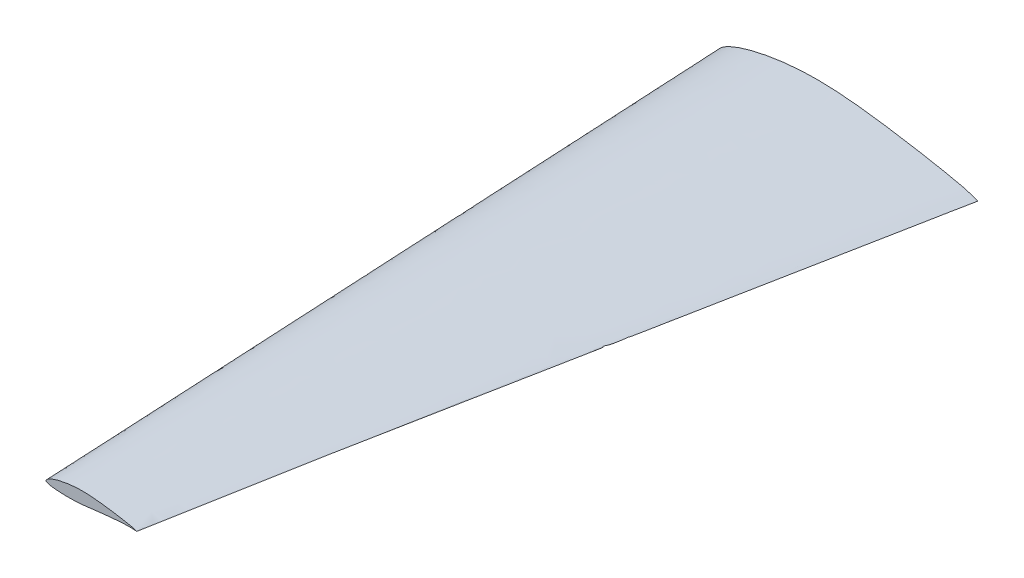
ISO-10303-21;
HEADER;
FILE_DESCRIPTION(('STEP AP214'),'2;1');
FILE_NAME('part.step','',(''),(''),'','','');
FILE_SCHEMA(('AUTOMOTIVE_DESIGN { 1 0 10303 214 1 1 1 1 }'));
ENDSEC;
DATA;
#1=APPLICATION_CONTEXT('core data for automotive mechanical design processes');
#2=APPLICATION_PROTOCOL_DEFINITION('international standard','automotive_design',2000,#1);
#3=PRODUCT_CONTEXT('',#1,'mechanical');
#4=PRODUCT('Part','Part','',(#3));
#5=PRODUCT_RELATED_PRODUCT_CATEGORY('part','',(#4));
#6=PRODUCT_DEFINITION_FORMATION('','',#4);
#7=PRODUCT_DEFINITION_CONTEXT('part definition',#1,'design');
#8=PRODUCT_DEFINITION('design','',#6,#7);
#9=PRODUCT_DEFINITION_SHAPE('','',#8);
#10=(LENGTH_UNIT() NAMED_UNIT(*) SI_UNIT(.MILLI.,.METRE.));
#11=(NAMED_UNIT(*) PLANE_ANGLE_UNIT() SI_UNIT($,.RADIAN.));
#12=(NAMED_UNIT(*) SI_UNIT($,.STERADIAN.) SOLID_ANGLE_UNIT());
#13=UNCERTAINTY_MEASURE_WITH_UNIT(LENGTH_MEASURE(1.E-05),#10,'distance_accuracy_value','');
#14=(GEOMETRIC_REPRESENTATION_CONTEXT(3) GLOBAL_UNCERTAINTY_ASSIGNED_CONTEXT((#13)) GLOBAL_UNIT_ASSIGNED_CONTEXT((#10,
#11,#12)) REPRESENTATION_CONTEXT('',''));
#15=CARTESIAN_POINT('',(0.,0.,0.));
#16=DIRECTION('',(0.,0.,1.));
#17=DIRECTION('',(1.,0.,0.));
#18=AXIS2_PLACEMENT_3D('',#15,#16,#17);
#19=CARTESIAN_POINT('',(-856.653077521207,-40.6182657315667,6200.));
#20=DIRECTION('',(0.,0.,-1.));
#21=DIRECTION('',(-1.,0.,0.));
#22=AXIS2_PLACEMENT_3D('',#19,#20,#21);
#23=PLANE('',#22);
#24=CARTESIAN_POINT('',(-62.768795980493,-35.2354448345607,6200.));
#25=CARTESIAN_POINT('',(-62.7715594343637,-35.161464044046,6200.));
#26=CARTESIAN_POINT('',(-68.4892533402153,-33.7410304315181,6200.));
#27=CARTESIAN_POINT('',(-73.904826244995,-31.6670699807893,6200.));
#28=CARTESIAN_POINT('',(-86.3598466861363,-27.6181263346662,6200.));
#29=CARTESIAN_POINT('',(-101.312613463051,-23.4228917248776,6200.));
#30=CARTESIAN_POINT('',(-120.663028845652,-19.1093216631822,6200.));
#31=CARTESIAN_POINT('',(-143.537697318301,-14.4997928532483,6200.));
#32=CARTESIAN_POINT('',(-169.96765777261,-9.5372939208794,6200.));
#33=CARTESIAN_POINT('',(-199.474894570233,-4.29466001199642,6200.));
#34=CARTESIAN_POINT('',(-231.673585589033,1.13715909285272,6200.));
#35=CARTESIAN_POINT('',(-266.103341203516,6.66239247620247,6200.));
#36=CARTESIAN_POINT('',(-302.315298237174,12.1170555043395,6200.));
#37=CARTESIAN_POINT('',(-339.831801501577,17.3685612770775,6200.));
#38=CARTESIAN_POINT('',(-378.195458339637,22.2344819950382,6200.));
#39=CARTESIAN_POINT('',(-416.948301893932,26.5125347132972,6200.));
#40=CARTESIAN_POINT('',(-455.653804819709,30.0334858752315,6200.));
#41=CARTESIAN_POINT('',(-493.937273776908,32.5535580846316,6200.));
#42=CARTESIAN_POINT('',(-531.514475712799,33.7529045585345,6200.));
#43=CARTESIAN_POINT('',(-568.17152624748,33.5367452774346,6200.));
#44=CARTESIAN_POINT('',(-603.752795326995,31.8255847079449,6200.));
#45=CARTESIAN_POINT('',(-638.085531914352,28.6992408412461,6200.));
#46=CARTESIAN_POINT('',(-670.953763146873,24.4271493642645,6200.));
#47=CARTESIAN_POINT('',(-702.076940726259,19.2471852213284,6200.));
#48=CARTESIAN_POINT('',(-731.123955821754,13.2516082607377,6200.));
#49=CARTESIAN_POINT('',(-757.800228679982,6.62191851956731,6200.));
#50=CARTESIAN_POINT('',(-781.832873554333,-0.503051287442359,6200.));
#51=CARTESIAN_POINT('',(-802.96618270177,-7.97014647053786,6200.));
#52=CARTESIAN_POINT('',(-820.995202148996,-15.6130550209624,6200.));
#53=CARTESIAN_POINT('',(-835.74658265942,-23.3233108305785,6200.));
#54=CARTESIAN_POINT('',(-847.09487174238,-30.9123353139702,6200.));
#55=CARTESIAN_POINT('',(-853.610586604553,-36.8048992419908,6200.));
#56=CARTESIAN_POINT('',(-857.201788544685,-41.2650967461758,6200.));
#57=CARTESIAN_POINT('',(-858.850318344285,-43.828182757875,6200.));
#58=CARTESIAN_POINT('',(-859.94828793429,-46.5664283398626,6200.));
#59=CARTESIAN_POINT('',(-860.250483793828,-48.2430082792743,6200.));
#60=CARTESIAN_POINT('',(-860.171358916499,-49.4139312981977,6200.));
#61=CARTESIAN_POINT('',(-859.685133378202,-50.5092914480428,6200.));
#62=CARTESIAN_POINT('',(-858.565856882824,-51.9098735302076,6200.));
#63=CARTESIAN_POINT('',(-856.191277168439,-54.0288947151431,6200.));
#64=CARTESIAN_POINT('',(-851.501078818877,-56.9533147580623,6200.));
#65=CARTESIAN_POINT('',(-842.868548954772,-60.6081626209987,6200.));
#66=CARTESIAN_POINT('',(-829.75844147582,-64.3709023541952,6200.));
#67=CARTESIAN_POINT('',(-812.184436093652,-67.8446748921428,6200.));
#68=CARTESIAN_POINT('',(-790.911582287878,-70.772200095514,6200.));
#69=CARTESIAN_POINT('',(-766.177051439535,-73.2167412462913,6200.));
#70=CARTESIAN_POINT('',(-738.276219223052,-75.1132874538173,6200.));
#71=CARTESIAN_POINT('',(-707.56561876685,-76.4014909147392,6200.));
#72=CARTESIAN_POINT('',(-674.43017274413,-77.0190676374616,6200.));
#73=CARTESIAN_POINT('',(-639.228914169513,-76.8125475071701,6200.));
#74=CARTESIAN_POINT('',(-602.270160843118,-75.5698410912889,6200.));
#75=CARTESIAN_POINT('',(-563.771507600199,-73.1566453823038,6200.));
#76=CARTESIAN_POINT('',(-523.862090680234,-69.4705576020164,6200.));
#77=CARTESIAN_POINT('',(-482.676106035862,-64.6873134822189,6200.));
#78=CARTESIAN_POINT('',(-440.43927569069,-59.4377296716919,6200.));
#79=CARTESIAN_POINT('',(-397.614659582081,-54.0859694749774,6200.));
#80=CARTESIAN_POINT('',(-354.801574741511,-48.9603022904963,6200.));
#81=CARTESIAN_POINT('',(-312.641252257449,-44.2739171415237,6200.));
#82=CARTESIAN_POINT('',(-271.796442142331,-40.2654907769843,6200.));
#83=CARTESIAN_POINT('',(-232.942495214821,-37.0545696704387,6200.));
#84=CARTESIAN_POINT('',(-196.761922382884,-34.6928701852552,6200.));
#85=CARTESIAN_POINT('',(-163.854579095046,-33.2402187187982,6200.));
#86=CARTESIAN_POINT('',(-134.953823384428,-32.5683565258773,6200.));
#87=CARTESIAN_POINT('',(-110.228146214666,-32.6492910205264,6200.));
#88=CARTESIAN_POINT('',(-91.155438971044,-33.0455684548176,6200.));
#89=CARTESIAN_POINT('',(-75.5493675084802,-34.0613780335465,6200.));
#90=CARTESIAN_POINT('',(-69.0897037754122,-34.3503679361492,6200.));
#91=CARTESIAN_POINT('',(-62.7659414177071,-35.311864713945,6200.));
#92=CARTESIAN_POINT('',(-62.768795980493,-35.2354448345607,6200.));
#93=B_SPLINE_CURVE_WITH_KNOTS('',3,(#24,#25,#26,#27,#28,#29,#30,#31,#32,#33,#34,#35,#36,#37,#38,
#39,#40,#41,#42,#43,#44,#45,#46,#47,#48,#49,#50,#51,#52,#53,#54,#55,#56,#57,#58,#59,#60,#61,#62,
#63,#64,#65,#66,#67,#68,#69,#70,#71,#72,#73,#74,#75,#76,#77,#78,#79,#80,#81,#82,#83,#84,#85,#86,
#87,#88,#89,#90,#91,#92),.UNSPECIFIED.,.T.,.F.,(4,1,1,1,1,1,1,1,1,1,1,1,1,1,1,1,1,1,1,1,1,1,1,1,
1,1,1,1,1,1,1,1,1,1,1,1,1,1,1,1,1,1,1,1,1,1,1,1,1,1,1,1,1,1,1,1,1,1,1,1,1,1,1,1,1,1,4),(0.,
0.00178025429931348,0.00677661855276226,0.014307631931115,0.0240462466109695,0.0361164032384218,
0.0505469730630571,0.0671298835400742,0.0856244289456062,0.10576729194862,0.127282098412942,
0.149864114045041,0.173229760189317,0.197069077892929,0.221103034083199,0.245051957369849,
0.268663179942347,0.291772797822348,0.314298508345449,0.336177511433891,0.357377359215959,
0.377791670496789,0.397224888102935,0.415489312865215,0.432417328029751,0.447849235180273,
0.461650757544391,0.473686992386839,0.483898395757803,0.492262508108233,0.498796820958936,
0.499955027372734,0.502810607326279,0.504371243067385,0.50535998755193,0.505924933279694,
0.506503368203689,0.507535007041587,0.509204749770686,0.512345281497249,0.517665407870953,
0.526421681932562,0.537424925562334,0.550643204547595,0.565965823835836,0.583206168779579,
0.6021549785986,0.622586582637333,0.644254823208852,0.666997978581174,0.690702845759673,
0.715307475272001,0.740824202204505,0.767084355637659,0.793717038600972,0.82033109971691,
0.846519300878587,0.871863223081629,0.895937170924907,0.918334876492831,0.938667169413558,
0.956573464196435,0.971715275283217,0.983839006179547,0.992717916559063,0.998161052107173,1.),.UNSPECIFIED.);
#94=CARTESIAN_POINT('',(-62.768795980493,-35.2354448345607,6200.));
#95=VERTEX_POINT('',#94);
#96=EDGE_CURVE('E11',#95,#95,#93,.T.);
#97=ORIENTED_EDGE('',*,*,#96,.T.);
#98=EDGE_LOOP('',(#97));
#99=FACE_BOUND('',#98,.T.);
#100=ADVANCED_FACE('F51',(#99),#23,.F.);
#101=CARTESIAN_POINT('',(-1152.26626391296,-12.2003702878728,0.));
#102=DIRECTION('',(0.,0.,-1.));
#103=DIRECTION('',(-1.,0.,0.));
#104=AXIS2_PLACEMENT_3D('',#101,#102,#103);
#105=PLANE('',#104);
#106=CARTESIAN_POINT('',(1122.2058981927,-30.8287655417814,0.));
#107=CARTESIAN_POINT('',(1122.20115465393,-30.616714157466,0.));
#108=CARTESIAN_POINT('',(1105.88259010497,-26.302372430673,0.));
#109=CARTESIAN_POINT('',(1090.45754080574,-20.128829088461,0.));
#110=CARTESIAN_POINT('',(1054.9512815124,-7.99563699588107,0.));
#111=CARTESIAN_POINT('',(1012.29599935876,4.66375979651589,0.));
#112=CARTESIAN_POINT('',(957.04784294867,17.8507612083849,0.));
#113=CARTESIAN_POINT('',(891.716447525941,32.0367462273664,0.));
#114=CARTESIAN_POINT('',(816.215341075556,47.3863666228463,0.));
#115=CARTESIAN_POINT('',(731.9107718024,63.6704700489651,0.));
#116=CARTESIAN_POINT('',(639.904104118504,80.6119651921873,0.));
#117=CARTESIAN_POINT('',(541.510109284894,97.9167515276931,0.));
#118=CARTESIAN_POINT('',(438.007613140291,115.09581096489,0.));
#119=CARTESIAN_POINT('',(330.759268640408,131.748835691453,0.));
#120=CARTESIAN_POINT('',(221.067545036545,147.33360763959,0.));
#121=CARTESIAN_POINT('',(110.235704933439,161.251005054439,0.));
#122=CARTESIAN_POINT('',(-0.492989421787764,172.997502315641,0.));
#123=CARTESIAN_POINT('',(-110.055608812469,181.858679944371,0.));
#124=CARTESIAN_POINT('',(-217.651628228843,186.906082107041,0.));
#125=CARTESIAN_POINT('',(-322.67239779899,187.859019165266,0.));
#126=CARTESIAN_POINT('',(-424.675493361954,184.483085412563,0.));
#127=CARTESIAN_POINT('',(-523.162611524368,176.999526502167,0.));
#128=CARTESIAN_POINT('',(-617.503498840836,166.17093241627,0.));
#129=CARTESIAN_POINT('',(-706.884266129657,152.666711489326,0.));
#130=CARTESIAN_POINT('',(-790.352428612782,136.7369598375,0.));
#131=CARTESIAN_POINT('',(-867.056319021184,118.888986738304,0.));
#132=CARTESIAN_POINT('',(-936.208246875165,99.5088027623838,0.));
#133=CARTESIAN_POINT('',(-997.069117294322,79.0241834004041,0.));
#134=CARTESIAN_POINT('',(-1049.04466548759,57.9027726884214,0.));
#135=CARTESIAN_POINT('',(-1091.63364572143,36.4478589204407,0.));
#136=CARTESIAN_POINT('',(-1124.4685862203,15.1942829283517,0.));
#137=CARTESIAN_POINT('',(-1143.38688648303,-1.40670261872229,0.));
#138=CARTESIAN_POINT('',(-1153.8658987359,-14.0298144732624,0.));
#139=CARTESIAN_POINT('',(-1158.69837124572,-21.3015870958212,0.));
#140=CARTESIAN_POINT('',(-1161.96116557527,-29.0987523051228,0.));
#141=CARTESIAN_POINT('',(-1162.89877256632,-33.8886922166885,0.));
#142=CARTESIAN_POINT('',(-1162.72232265553,-37.2464304163831,0.));
#143=CARTESIAN_POINT('',(-1161.37641018475,-40.4051635389474,0.));
#144=CARTESIAN_POINT('',(-1158.2300863755,-44.4654169714448,0.));
#145=CARTESIAN_POINT('',(-1151.51850668726,-50.6376219777177,0.));
#146=CARTESIAN_POINT('',(-1138.20791379313,-59.2163676999068,0.));
#147=CARTESIAN_POINT('',(-1113.63504585877,-70.0566519156926,0.));
#148=CARTESIAN_POINT('',(-1076.23988302444,-81.3980510511196,0.));
#149=CARTESIAN_POINT('',(-1026.0445928557,-92.1030957383134,0.));
#150=CARTESIAN_POINT('',(-965.229779180064,-101.401943352952,0.));
#151=CARTESIAN_POINT('',(-894.477580423596,-109.465652354948,0.));
#152=CARTESIAN_POINT('',(-814.631371427864,-116.09531772094,0.));
#153=CARTESIAN_POINT('',(-726.709924863051,-121.102769823313,0.));
#154=CARTESIAN_POINT('',(-631.81325792365,-124.293074846313,0.));
#155=CARTESIAN_POINT('',(-530.963310823338,-125.211188342904,0.));
#156=CARTESIAN_POINT('',(-425.034225737718,-123.236314136182,0.));
#157=CARTESIAN_POINT('',(-314.643586800013,-117.974381898108,0.));
#158=CARTESIAN_POINT('',(-200.156938848306,-109.126499791224,0.));
#159=CARTESIAN_POINT('',(-81.9662502529353,-97.1903427138153,0.));
#160=CARTESIAN_POINT('',(39.2547979910437,-83.9633310166969,0.));
#161=CARTESIAN_POINT('',(162.164059051418,-70.4688237938537,0.));
#162=CARTESIAN_POINT('',(285.030589665615,-57.6215109480256,0.));
#163=CARTESIAN_POINT('',(406.008310953053,-46.0046138520639,0.));
#164=CARTESIAN_POINT('',(523.188405612224,-36.2734456824879,0.));
#165=CARTESIAN_POINT('',(634.631068124435,-28.7415065353594,0.));
#166=CARTESIAN_POINT('',(738.378890591227,-23.5276764186368,0.));
#167=CARTESIAN_POINT('',(832.710900485001,-20.777613140111,0.));
#168=CARTESIAN_POINT('',(915.531746960598,-20.0924410267603,0.));
#169=CARTESIAN_POINT('',(986.359954304663,-21.3847433442597,0.));
#170=CARTESIAN_POINT('',(1040.98056697541,-23.3379611282725,0.));
#171=CARTESIAN_POINT('',(1085.64373290725,-26.9172743422512,0.));
#172=CARTESIAN_POINT('',(1104.13634536753,-28.0221898809687,0.));
#173=CARTESIAN_POINT('',(1122.21079812224,-31.0478080945832,0.));
#174=CARTESIAN_POINT('',(1122.2058981927,-30.8287655417814,0.));
#175=B_SPLINE_CURVE_WITH_KNOTS('',3,(#106,#107,#108,#109,#110,#111,#112,#113,#114,#115,#116,
#117,#118,#119,#120,#121,#122,#123,#124,#125,#126,#127,#128,#129,#130,#131,#132,#133,#134,#135,
#136,#137,#138,#139,#140,#141,#142,#143,#144,#145,#146,#147,#148,#149,#150,#151,#152,#153,#154,
#155,#156,#157,#158,#159,#160,#161,#162,#163,#164,#165,#166,#167,#168,#169,#170,#171,#172,#173,
#174),.UNSPECIFIED.,.T.,.F.,(4,1,1,1,1,1,1,1,1,1,1,1,1,1,1,1,1,1,1,1,1,1,1,1,1,1,1,1,1,1,1,1,1,
1,1,1,1,1,1,1,1,1,1,1,1,1,1,1,1,1,1,1,1,1,1,1,1,1,1,1,1,1,1,1,1,1,4),(0.,0.00178025429931348,
0.00677661855276226,0.014307631931115,0.0240462466109695,0.0361164032384218,0.0505469730630571,
0.0671298835400742,0.0856244289456062,0.10576729194862,0.127282098412942,0.149864114045041,
0.173229760189317,0.197069077892929,0.221103034083199,0.245051957369849,0.268663179942347,
0.291772797822348,0.314298508345449,0.336177511433891,0.357377359215959,0.377791670496789,
0.397224888102935,0.415489312865215,0.432417328029751,0.447849235180273,0.461650757544391,
0.473686992386839,0.483898395757803,0.492262508108233,0.498796820958936,0.499955027372734,
0.502810607326279,0.504371243067385,0.50535998755193,0.505924933279694,0.506503368203689,
0.507535007041587,0.509204749770686,0.512345281497249,0.517665407870953,0.526421681932562,
0.537424925562334,0.550643204547595,0.565965823835836,0.583206168779579,0.6021549785986,
0.622586582637333,0.644254823208852,0.666997978581174,0.690702845759673,0.715307475272001,
0.740824202204505,0.767084355637659,0.793717038600972,0.82033109971691,0.846519300878587,
0.871863223081629,0.895937170924907,0.918334876492831,0.938667169413558,0.956573464196435,
0.971715275283217,0.983839006179547,0.992717916559063,0.998161052107173,1.),.UNSPECIFIED.);
#176=CARTESIAN_POINT('',(1122.2058981927,-30.8287655417814,0.));
#177=VERTEX_POINT('',#176);
#178=EDGE_CURVE('E62',#177,#177,#175,.T.);
#179=ORIENTED_EDGE('',*,*,#178,.F.);
#180=EDGE_LOOP('',(#179));
#181=FACE_BOUND('',#180,.T.);
#182=ADVANCED_FACE('F91',(#181),#105,.T.);
#183=CARTESIAN_POINT('',(-829.212772496665,127.551706357056,0.));
#184=CARTESIAN_POINT('',(-729.58238945558,13.4038053108561,6200.));
#185=CARTESIAN_POINT('',(-831.317274890692,127.061718606732,0.));
#186=CARTESIAN_POINT('',(-730.318211721742,13.2383485653586,6200.));
#187=CARTESIAN_POINT('',(-844.668148264337,123.928740686031,0.));
#188=CARTESIAN_POINT('',(-734.986497610126,12.1809427873616,6200.));
#189=CARTESIAN_POINT('',(-872.329771938532,117.109052219102,0.));
#190=CARTESIAN_POINT('',(-744.662471920196,9.88696426547185,6200.));
#191=CARTESIAN_POINT('',(-906.646678696621,107.793584513178,0.));
#192=CARTESIAN_POINT('',(-756.67522169935,6.77052491164006,6200.));
#193=CARTESIAN_POINT('',(-943.806753069503,96.7062821112164,0.));
#194=CARTESIAN_POINT('',(-769.701597856569,3.09351386462406,6200.));
#195=CARTESIAN_POINT('',(-972.975630231256,87.1335960359868,0.));
#196=CARTESIAN_POINT('',(-779.941039136108,-0.0587731598857236,6200.));
#197=CARTESIAN_POINT('',(-1007.05666113912,74.800467805899,0.));
#198=CARTESIAN_POINT('',(-791.937939174986,-4.07350427681673,6200.));
#199=CARTESIAN_POINT('',(-1030.66516722207,65.3716873038617,0.));
#200=CARTESIAN_POINT('',(-800.271635923456,-7.11409770871183,6200.));
#201=CARTESIAN_POINT('',(-1061.25131138476,51.6962297013703,0.));
#202=CARTESIAN_POINT('',(-811.137073165823,-11.4339714874833,6200.));
#203=CARTESIAN_POINT('',(-1079.00722114432,42.8086322710204,0.));
#204=CARTESIAN_POINT('',(-817.485959529064,-14.1945671402748,6200.));
#205=CARTESIAN_POINT('',(-1104.0563484032,28.4068254523512,0.));
#206=CARTESIAN_POINT('',(-826.581899048501,-18.5570678431818,6200.));
#207=CARTESIAN_POINT('',(-1117.40931977586,19.7636426879801,0.));
#208=CARTESIAN_POINT('',(-831.50107274205,-21.1272097641271,6200.));
#209=CARTESIAN_POINT('',(-1135.66170921193,5.37221274075266,0.));
#210=CARTESIAN_POINT('',(-838.462484807711,-25.2462877286109,6200.));
#211=CARTESIAN_POINT('',(-1144.51533440074,-2.76604107005167,0.));
#212=CARTESIAN_POINT('',(-841.975859971961,-27.5093717871831,6200.));
#213=CARTESIAN_POINT('',(-1152.82466426129,-12.7755341152811,0.));
#214=CARTESIAN_POINT('',(-845.654984774398,-30.176591122042,6200.));
#215=CARTESIAN_POINT('',(-1156.43685610927,-17.8985208970397,0.));
#216=CARTESIAN_POINT('',(-847.387479055175,-31.5040720435642,6200.));
#217=CARTESIAN_POINT('',(-1159.78948712803,-23.9090486571599,0.));
#218=CARTESIAN_POINT('',(-849.254612158242,-33.0194591670761,6200.));
#219=CARTESIAN_POINT('',(-1161.96116557527,-29.0987523051228,0.));
#220=CARTESIAN_POINT('',(-850.738397935686,-34.2990813241094,6200.));
#221=CARTESIAN_POINT('',(-1162.89877256632,-33.8886922166885,0.));
#222=CARTESIAN_POINT('',(-851.981208617759,-35.4505936480285,6200.));
#223=CARTESIAN_POINT('',(-1162.72232265553,-37.2464304163831,0.));
#224=CARTESIAN_POINT('',(-852.811957439663,-36.2586543969076,6200.));
#225=CARTESIAN_POINT('',(-1161.37641018475,-40.4051635389474,0.));
#226=CARTESIAN_POINT('',(-853.643168007229,-37.0983983043348,6200.));
#227=CARTESIAN_POINT('',(-1159.10106133558,-43.3414452235634,0.));
#228=CARTESIAN_POINT('',(-854.522834034568,-38.0388249855981,6200.));
#229=CARTESIAN_POINT('',(-1156.16964821432,-46.3602684556404,0.));
#230=CARTESIAN_POINT('',(-855.486598587112,-39.1434251619636,6200.));
#231=CARTESIAN_POINT('',(-1153.91361001837,-48.3250763254306,0.));
#232=CARTESIAN_POINT('',(-856.144369435414,-39.9518043859372,6200.));
#233=CARTESIAN_POINT('',(-1149.03786328623,-52.2298240683766,0.));
#234=CARTESIAN_POINT('',(-857.470291301179,-41.6825569943552,6200.));
#235=CARTESIAN_POINT('',(-1144.90446537918,-54.8737396933434,0.));
#236=CARTESIAN_POINT('',(-858.399044100502,-43.1265547363725,6200.));
#237=CARTESIAN_POINT('',(-1138.9181686672,-58.2614101000769,0.));
#238=CARTESIAN_POINT('',(-859.437447764451,-45.2924350973393,6200.));
#239=CARTESIAN_POINT('',(-1135.4091253734,-60.1148944181189,0.));
#240=CARTESIAN_POINT('',(-859.951652511742,-46.5850949856236,6200.));
#241=CARTESIAN_POINT('',(-1131.08615349649,-62.1841176949411,0.));
#242=CARTESIAN_POINT('',(-860.250483793828,-48.2430082792743,6200.));
#243=CARTESIAN_POINT('',(-1128.06274934849,-63.5521161542971,0.));
#244=CARTESIAN_POINT('',(-860.171358916499,-49.4139312981977,6200.));
#245=CARTESIAN_POINT('',(-1124.95796674343,-64.9026058966147,0.));
#246=CARTESIAN_POINT('',(-859.685133378202,-50.5092914480428,6200.));
#247=CARTESIAN_POINT('',(-1121.73341081225,-66.2335443462341,0.));
#248=CARTESIAN_POINT('',(-858.920544702188,-51.4660427103745,6200.));
#249=CARTESIAN_POINT('',(-1117.82043818841,-67.7747409487299,0.));
#250=CARTESIAN_POINT('',(-857.890282720745,-52.5127406198101,6200.));
#251=CARTESIAN_POINT('',(-1110.81630996231,-70.4178750778562,0.));
#252=CARTESIAN_POINT('',(-855.899412613526,-54.2108773287962,6200.));
#253=CARTESIAN_POINT('',(-1097.91346925882,-74.794649303126,0.));
#254=CARTESIAN_POINT('',(-851.845410916671,-56.738617721144,6200.));
#255=CARTESIAN_POINT('',(-1085.2426026253,-78.3923142275133,0.));
#256=CARTESIAN_POINT('',(-847.631826926625,-58.5914819271515,6200.));
#257=CARTESIAN_POINT('',(-1064.0438471973,-83.8943130669101,0.));
#258=CARTESIAN_POINT('',(-840.476286073484,-61.2947674112436,6200.));
#259=CARTESIAN_POINT('',(-1047.31549656837,-87.5396152358559,0.));
#260=CARTESIAN_POINT('',(-834.724461756159,-62.9456019243787,6200.));
#261=CARTESIAN_POINT('',(-1017.11718752095,-93.2604952047965,0.));
#262=CARTESIAN_POINT('',(-824.291101711021,-65.4516061731355,6200.));
#263=CARTESIAN_POINT('',(-994.512717814773,-96.9244555894391,0.));
#264=CARTESIAN_POINT('',(-816.441328873008,-66.9737211472728,6200.));
#265=CARTESIAN_POINT('',(-959.517300940798,-101.820414140808,0.));
#266=CARTESIAN_POINT('',(-804.264962226887,-68.9345361563659,6200.));
#267=CARTESIAN_POINT('',(-930.120025114471,-105.403442174085,0.));
#268=CARTESIAN_POINT('',(-794.016105143911,-70.2929791921303,6200.));
#269=CARTESIAN_POINT('',(-891.7247045248,-109.432084324852,0.));
#270=CARTESIAN_POINT('',(-780.62423199707,-71.7889103485822,6200.));
#271=CARTESIAN_POINT('',(-856.001094532176,-112.660371667584,0.));
#272=CARTESIAN_POINT('',(-768.158231439812,-72.9520154340786,6200.));
#273=CARTESIAN_POINT('',(-814.532681305565,-115.819272508077,0.));
#274=CARTESIAN_POINT('',(-753.685229767612,-74.0658670656631,6200.));
#275=CARTESIAN_POINT('',(-773.108617956048,-118.460192359524,0.));
#276=CARTESIAN_POINT('',(-739.225029964666,-74.9682045357942,6200.));
#277=CARTESIAN_POINT('',(-728.921749644987,-120.727861061569,0.));
#278=CARTESIAN_POINT('',(-723.800256947369,-75.7205039988114,6200.));
#279=CARTESIAN_POINT('',(-682.487865335895,-122.589459115857,0.));
#280=CARTESIAN_POINT('',(-707.590660019816,-76.3097386548065,6200.));
#281=CARTESIAN_POINT('',(-635.955138152636,-123.896306526208,0.));
#282=CARTESIAN_POINT('',(-691.347393323977,-76.7037653585633,6200.));
#283=CARTESIAN_POINT('',(-585.260805311164,-124.716877101761,0.));
#284=CARTESIAN_POINT('',(-673.652310293935,-76.9209585080612,6200.));
#285=CARTESIAN_POINT('',(-536.786168998662,-124.87048910916,0.));
#286=CARTESIAN_POINT('',(-656.732725680856,-76.9152395579744,6200.));
#287=CARTESIAN_POINT('',(-482.492900731309,-124.307536974608,0.));
#288=CARTESIAN_POINT('',(-637.783141412262,-76.6600050768735,6200.));
#289=CARTESIAN_POINT('',(-432.360602340538,-123.075537445922,0.));
#290=CARTESIAN_POINT('',(-620.286570420433,-76.1756274276176,6200.));
#291=CARTESIAN_POINT('',(-374.939789857097,-120.848489139018,0.));
#292=CARTESIAN_POINT('',(-600.247094685126,-75.335952800521,6200.));
#293=CARTESIAN_POINT('',(-323.370046071191,-118.09044414298,0.));
#294=CARTESIAN_POINT('',(-582.250512499396,-74.3149574678638,6200.));
#295=CARTESIAN_POINT('',(-263.15085491722,-113.994864380462,0.));
#296=CARTESIAN_POINT('',(-561.236484633782,-72.8146584269182,6200.));
#297=CARTESIAN_POINT('',(-210.284693563039,-109.67206859194,0.));
#298=CARTESIAN_POINT('',(-542.791640178183,-71.2189164224588,6200.));
#299=CARTESIAN_POINT('',(-147.384354844682,-103.796961064155,0.));
#300=CARTESIAN_POINT('',(-520.84910067178,-69.0353288010891,6200.));
#301=CARTESIAN_POINT('',(-93.2092486238008,-98.2450851262363,0.));
#302=CARTESIAN_POINT('',(-501.958483832971,-66.9267238304267,6200.));
#303=CARTESIAN_POINT('',(-27.8304514469903,-91.2833252905878,0.));
#304=CARTESIAN_POINT('',(-479.169318703095,-64.2226178676051,6200.));
#305=CARTESIAN_POINT('',(27.4540158470234,-85.2442429686546,0.));
#306=CARTESIAN_POINT('',(-459.902845380998,-61.8568420791878,6200.));
#307=CARTESIAN_POINT('',(94.5362159736375,-77.8938494510345,0.));
#308=CARTESIAN_POINT('',(-436.529026607753,-58.9466915980994,6200.));
#309=CARTESIAN_POINT('',(150.399084420195,-71.8126718103479,0.));
#310=CARTESIAN_POINT('',(-417.066692698759,-56.516875482751,6200.));
#311=CARTESIAN_POINT('',(218.052527080542,-64.6249489024986,0.));
#312=CARTESIAN_POINT('',(-393.498661069387,-53.6114048020775,6200.));
#313=CARTESIAN_POINT('',(273.92088784551,-58.8690589705035,0.));
#314=CARTESIAN_POINT('',(-374.036459080019,-51.2631406825048,6200.));
#315=CARTESIAN_POINT('',(340.93858887613,-52.2529400511864,0.));
#316=CARTESIAN_POINT('',(-350.690306423905,-48.5329519861592,6200.));
#317=CARTESIAN_POINT('',(396.199038728307,-47.0789112281331,0.));
#318=CARTESIAN_POINT('',(-331.439751588612,-46.3634886366619,6200.));
#319=CARTESIAN_POINT('',(461.320625473981,-41.4112276117029,0.));
#320=CARTESIAN_POINT('',(-308.753293045658,-43.9374760795189,6200.));
#321=CARTESIAN_POINT('',(515.337224217674,-37.0861281590095,0.));
#322=CARTESIAN_POINT('',(-289.934159161162,-42.0454893345961,6200.));
#323=CARTESIAN_POINT('',(577.258841300722,-32.6190531717214,0.));
#324=CARTESIAN_POINT('',(-268.359116035545,-40.0354623226404,6200.));
#325=CARTESIAN_POINT('',(629.366984438511,-29.2820134970874,0.));
#326=CARTESIAN_POINT('',(-250.199918115741,-38.4807368379733,6200.));
#327=CARTESIAN_POINT('',(686.772059362488,-26.1211694143586,0.));
#328=CARTESIAN_POINT('',(-230.190766005176,-36.9362124693548,6200.));
#329=CARTESIAN_POINT('',(736.328839140367,-23.8635086431708,0.));
#330=CARTESIAN_POINT('',(-212.918893730077,-35.7475221137926,6200.));
#331=CARTESIAN_POINT('',(788.002218715096,-22.0810063796398,0.));
#332=CARTESIAN_POINT('',(-194.910643233478,-34.6870553327078,6200.));
#333=CARTESIAN_POINT('',(834.38139659096,-20.9690165880571,0.));
#334=CARTESIAN_POINT('',(-178.727987445247,-33.896785803602,6200.));
#335=CARTESIAN_POINT('',(878.99634997574,-20.3946962708141,0.));
#336=CARTESIAN_POINT('',(-163.142037505237,-33.3008697271638,6200.));
#337=CARTESIAN_POINT('',(921.647415286621,-20.3694249005862,0.));
#338=CARTESIAN_POINT('',(-148.295180486024,-32.8785059741675,6200.));
#339=CARTESIAN_POINT('',(958.504069283349,-20.8764963319617,0.));
#340=CARTESIAN_POINT('',(-135.510280924919,-32.6682439882748,6200.));
#341=CARTESIAN_POINT('',(996.654106057196,-21.7998066323774,0.));
#342=CARTESIAN_POINT('',(-122.064312897899,-32.6105477269651,6200.));
#343=CARTESIAN_POINT('',(1023.59805672151,-22.7163674386636,0.));
#344=CARTESIAN_POINT('',(-112.412379290161,-32.6760951790322,6200.));
#345=CARTESIAN_POINT('',(1057.02471947582,-24.6237420587924,0.));
#346=CARTESIAN_POINT('',(-101.18562116369,-32.8392427438664,6200.));
#347=CARTESIAN_POINT('',(1077.49998130459,-26.2646327949135,0.));
#348=CARTESIAN_POINT('',(-94.6941918255419,-33.009619548974,6200.));
#349=CARTESIAN_POINT('',(1096.51434026752,-27.5667825182028,0.));
#350=CARTESIAN_POINT('',(-86.6469975263049,-33.38193473273,6200.));
#351=CARTESIAN_POINT('',(1105.67791723966,-28.2802451591675,0.));
#352=CARTESIAN_POINT('',(-82.4375472939011,-33.6230395308461,6200.));
#353=CARTESIAN_POINT('',(1126.62946792812,-31.7874823755161,0.));
#354=CARTESIAN_POINT('',(-77.8876378359587,-33.8923268777434,6200.));
#355=CARTESIAN_POINT('',(1116.86025871113,-29.2046751171854,0.));
#356=CARTESIAN_POINT('',(-75.8364895855708,-34.0107507406302,6200.));
#357=CARTESIAN_POINT('',(1103.491455609,-25.3453724132622,0.));
#358=CARTESIAN_POINT('',(-72.5980037678546,-34.1890532113823,6200.));
#359=CARTESIAN_POINT('',(1097.0452454279,-22.7845847338405,0.));
#360=CARTESIAN_POINT('',(-70.1782586354595,-34.3016685957528,6200.));
#361=CARTESIAN_POINT('',(1087.42865464012,-19.2546957028556,0.));
#362=CARTESIAN_POINT('',(-65.1309262770274,-34.9522804675506,6200.));
#363=CARTESIAN_POINT('',(1081.04664116436,-16.9830658815047,0.));
#364=CARTESIAN_POINT('',(-61.2199683158535,-35.5469222749205,6200.));
#365=CARTESIAN_POINT('',(1071.06563858708,-13.5486299785771,0.));
#366=CARTESIAN_POINT('',(-66.8279435409385,-34.1537458231727,6200.));
#367=CARTESIAN_POINT('',(1060.50819804484,-10.056396018161,0.));
#368=CARTESIAN_POINT('',(-70.3089871261627,-33.0441409298406,6200.));
#369=CARTESIAN_POINT('',(1041.50184695625,-4.01175525501411,0.));
#370=CARTESIAN_POINT('',(-75.5982630233145,-31.1165586334904,6200.));
#371=CARTESIAN_POINT('',(1027.26772968906,0.144425406295233,0.));
#372=CARTESIAN_POINT('',(-81.045792296128,-29.3456471251182,6200.));
#373=CARTESIAN_POINT('',(1001.62865513992,7.08739145621461,0.));
#374=CARTESIAN_POINT('',(-90.3195702335817,-26.5071634259767,6200.));
#375=CARTESIAN_POINT('',(982.966051303696,11.6644289870184,0.));
#376=CARTESIAN_POINT('',(-96.5959040469761,-24.750384373016,6200.));
#377=CARTESIAN_POINT('',(950.144604936312,19.2458146052146,0.));
#378=CARTESIAN_POINT('',(-107.885024279721,-21.9577782391256,6200.));
#379=CARTESIAN_POINT('',(924.33917366243,24.9530845168502,0.));
#380=CARTESIAN_POINT('',(-116.957770807607,-19.9540324347636,6200.));
#381=CARTESIAN_POINT('',(887.987857285188,32.69169943721,0.));
#382=CARTESIAN_POINT('',(-129.689332312654,-17.2904097988158,6200.));
#383=CARTESIAN_POINT('',(855.221667660565,39.456253618536,0.));
#384=CARTESIAN_POINT('',(-141.121593196333,-15.0117776108221,6200.));
#385=CARTESIAN_POINT('',(815.432732418883,47.4360612844001,0.));
#386=CARTESIAN_POINT('',(-155.022712636192,-12.3433622240084,6200.));
#387=CARTESIAN_POINT('',(776.394699370867,55.0780428107947,0.));
#388=CARTESIAN_POINT('',(-168.679885661002,-9.8069256347877,6200.));
#389=CARTESIAN_POINT('',(733.635824341301,63.2422481642765,0.));
#390=CARTESIAN_POINT('',(-183.635091475217,-7.10896246212119,6200.));
#391=CARTESIAN_POINT('',(689.091320489789,71.5549586921182,0.));
#392=CARTESIAN_POINT('',(-199.21112548578,-4.37411488129265,6200.));
#393=CARTESIAN_POINT('',(643.736426124317,79.8207718283999,0.));
#394=CARTESIAN_POINT('',(-215.071766812031,-1.66351613818426,6200.));
#395=CARTESIAN_POINT('',(594.501021823446,88.5971134669171,0.));
#396=CARTESIAN_POINT('',(-232.290856730568,1.2051024671473,6200.));
#397=CARTESIAN_POINT('',(546.979513719382,96.853397494808,0.));
#398=CARTESIAN_POINT('',(-248.908737025029,3.9030292647919,6200.));
#399=CARTESIAN_POINT('',(493.926468036363,105.814553336306,0.));
#400=CARTESIAN_POINT('',(-267.458845845602,6.83009819304655,6200.));
#401=CARTESIAN_POINT('',(444.688425495608,113.877854677755,0.));
#402=CARTESIAN_POINT('',(-284.673943019988,9.45971091564532,6200.));
#403=CARTESIAN_POINT('',(388.704102794846,122.75143101868,0.));
#404=CARTESIAN_POINT('',(-304.246471705889,12.3485218576794,6200.));
#405=CARTESIAN_POINT('',(338.176625068923,130.462695338541,0.));
#406=CARTESIAN_POINT('',(-321.909051000222,14.8597606285237,6200.));
#407=CARTESIAN_POINT('',(280.153653465495,138.9387762438,0.));
#408=CARTESIAN_POINT('',(-342.189067406293,17.6201472223101,6200.));
#409=CARTESIAN_POINT('',(228.796399931964,146.066997243604,0.));
#410=CARTESIAN_POINT('',(-360.136717597646,19.9439704025782,6200.));
#411=CARTESIAN_POINT('',(169.620247767252,153.793957673935,0.));
#412=CARTESIAN_POINT('',(-380.813547829779,22.4645748288211,6200.));
#413=CARTESIAN_POINT('',(117.849519700056,160.094803785025,0.));
#414=CARTESIAN_POINT('',(-398.900387153431,24.5201665763286,6200.));
#415=CARTESIAN_POINT('',(58.3714999328916,166.752946042191,0.));
#416=CARTESIAN_POINT('',(-419.676785548755,26.6913261619063,6200.));
#417=CARTESIAN_POINT('',(6.6138940947269,171.982487206937,0.));
#418=CARTESIAN_POINT('',(-437.753077169354,28.4050975827231,6200.));
#419=CARTESIAN_POINT('',(-52.3504098684943,177.191613559983,0.));
#420=CARTESIAN_POINT('',(-458.342023145395,30.1205473882759,6200.));
#421=CARTESIAN_POINT('',(-103.70759949545,180.989927104816,0.));
#422=CARTESIAN_POINT('',(-476.271878737161,31.3907044477913,6200.));
#423=CARTESIAN_POINT('',(-161.50417479336,184.272167028808,0.));
#424=CARTESIAN_POINT('',(-496.445788386139,32.5118180905998,6200.));
#425=CARTESIAN_POINT('',(-212.185034920291,186.250098279233,0.));
#426=CARTESIAN_POINT('',(-514.135464418887,33.1982210046383,6200.));
#427=CARTESIAN_POINT('',(-268.376964457372,187.366353469372,0.));
#428=CARTESIAN_POINT('',(-533.747761806926,33.6029321179937,6200.));
#429=CARTESIAN_POINT('',(-318.189108736857,187.36909905268,0.));
#430=CARTESIAN_POINT('',(-551.134229476092,33.6372108023001,6200.));
#431=CARTESIAN_POINT('',(-372.466520975377,186.211013678867,0.));
#432=CARTESIAN_POINT('',(-570.07975218566,33.2911763464613,6200.));
#433=CARTESIAN_POINT('',(-421.229723555246,184.136770996794,0.));
#434=CARTESIAN_POINT('',(-587.102435635046,32.626327337698,6200.));
#435=CARTESIAN_POINT('',(-473.348885586935,180.784630174145,0.));
#436=CARTESIAN_POINT('',(-605.298537546542,31.5270558633798,6200.));
#437=CARTESIAN_POINT('',(-520.928345688855,176.749110038894,0.));
#438=CARTESIAN_POINT('',(-621.909929147063,30.1721935251371,6200.));
#439=CARTESIAN_POINT('',(-570.605287004893,171.553982266356,0.));
#440=CARTESIAN_POINT('',(-639.254057596466,28.4036547958162,6200.));
#441=CARTESIAN_POINT('',(-616.782005390167,165.855506714599,0.));
#442=CARTESIAN_POINT('',(-655.375965402388,26.4518940638975,6200.));
#443=CARTESIAN_POINT('',(-663.514068565285,159.219359752704,0.));
#444=CARTESIAN_POINT('',(-671.691690802582,24.1689321914193,6200.));
#445=CARTESIAN_POINT('',(-707.942171735291,152.063883731346,0.));
#446=CARTESIAN_POINT('',(-687.207071998674,21.7220413513809,6200.));
#447=CARTESIAN_POINT('',(-751.094306198421,144.229303286467,0.));
#448=CARTESIAN_POINT('',(-702.280533153502,19.0553637820741,6200.));
#449=CARTESIAN_POINT('',(-791.304100998302,136.103996797552,0.));
#450=CARTESIAN_POINT('',(-716.330842903785,16.2975500316585,6200.));
#451=CARTESIAN_POINT('',(-816.926871373973,130.412212037109,0.));
#452=CARTESIAN_POINT('',(-725.286723348669,14.3697273364301,6200.));
#453=CARTESIAN_POINT('',(-829.212772496665,127.551706357056,0.));
#454=CARTESIAN_POINT('',(-729.58238945558,13.4038053108561,6200.));
#455=B_SPLINE_SURFACE_WITH_KNOTS('',3,1,((#183,#184),(#185,#186),(#187,#188),(#189,#190),(#191,
#192),(#193,#194),(#195,#196),(#197,#198),(#199,#200),(#201,#202),(#203,#204),(#205,#206),(#207,
#208),(#209,#210),(#211,#212),(#213,#214),(#215,#216),(#217,#218),(#219,#220),(#221,#222),(#223,
#224),(#225,#226),(#227,#228),(#229,#230),(#231,#232),(#233,#234),(#235,#236),(#237,#238),(#239,
#240),(#241,#242),(#243,#244),(#245,#246),(#247,#248),(#249,#250),(#251,#252),(#253,#254),(#255,
#256),(#257,#258),(#259,#260),(#261,#262),(#263,#264),(#265,#266),(#267,#268),(#269,#270),(#271,
#272),(#273,#274),(#275,#276),(#277,#278),(#279,#280),(#281,#282),(#283,#284),(#285,#286),(#287,
#288),(#289,#290),(#291,#292),(#293,#294),(#295,#296),(#297,#298),(#299,#300),(#301,#302),(#303,
#304),(#305,#306),(#307,#308),(#309,#310),(#311,#312),(#313,#314),(#315,#316),(#317,#318),(#319,
#320),(#321,#322),(#323,#324),(#325,#326),(#327,#328),(#329,#330),(#331,#332),(#333,#334),(#335,
#336),(#337,#338),(#339,#340),(#341,#342),(#343,#344),(#345,#346),(#347,#348),(#349,#350),(#351,
#352),(#353,#354),(#355,#356),(#357,#358),(#359,#360),(#361,#362),(#363,#364),(#365,#366),(#367,
#368),(#369,#370),(#371,#372),(#373,#374),(#375,#376),(#377,#378),(#379,#380),(#381,#382),(#383,
#384),(#385,#386),(#387,#388),(#389,#390),(#391,#392),(#393,#394),(#395,#396),(#397,#398),(#399,
#400),(#401,#402),(#403,#404),(#405,#406),(#407,#408),(#409,#410),(#411,#412),(#413,#414),(#415,
#416),(#417,#418),(#419,#420),(#421,#422),(#423,#424),(#425,#426),(#427,#428),(#429,#430),(#431,
#432),(#433,#434),(#435,#436),(#437,#438),(#439,#440),(#441,#442),(#443,#444),(#445,#446),(#447,
#448),(#449,#450),(#451,#452),(#453,#454)),.UNSPECIFIED.,.T.,.F.,.F.,(4,1,1,1,1,1,1,1,1,1,1,1,1,
1,1,1,1,1,1,1,1,1,1,1,1,1,1,1,1,1,1,1,1,1,1,1,1,1,1,1,1,1,1,1,1,1,1,1,1,1,1,1,1,1,1,1,1,1,1,1,1,
1,1,1,1,1,1,1,1,1,1,1,1,1,1,1,1,1,1,1,1,1,1,1,1,1,1,1,1,1,1,1,1,1,1,1,1,1,1,1,1,1,1,1,1,1,1,1,1,
1,1,1,1,1,1,1,1,1,1,1,1,1,1,1,1,1,1,1,1,1,1,1,1,4),(2,2),(0.,0.0013893128653531,
0.00881732802982421,0.0183173280298888,0.0242492351803458,0.0337492351804104,0.0380507575444643,
0.0475507575445289,0.0500869923869119,0.0595869923869766,0.0602983957578761,0.0686625081083062,
0.0697983957579407,0.0751968209590087,0.0763550273728072,0.0781625081083708,0.0792106073263521,
0.0807712430674585,0.081759987552003,0.082324933279767,0.0829033682037622,0.0839350070416607,
0.0846968209590733,0.0856047497707592,0.0858550273728719,0.0887106073264167,0.0887452814973226,
0.0902712430675232,0.0912599875520676,0.0918249332798316,0.0924033682038268,0.0934350070417253,
0.0940654078710264,0.0951047497708238,0.0982452814973873,0.102821681932635,0.103565407871091,
0.1123216819327,0.113824925562408,0.123324925562472,0.127043204547668,0.136543204547732,
0.142365823835909,0.151865823835973,0.159606168779653,0.169106168779717,0.178554978598673,
0.188054978598738,0.198986582637406,0.208486582637471,0.220654823208925,0.23015482320899,
0.243397978581248,0.252897978581312,0.267102845759746,0.27660284575981,0.291707475272074,
0.301207475272139,0.317224202204578,0.326724202204643,0.343484355637733,0.352984355637797,
0.370117038601045,0.379617038601109,0.396731099716984,0.406231099717048,0.42291930087866,
0.432419300878725,0.448263223081702,0.457763223081766,0.47233717092498,0.481837170925045,
0.494734876492904,0.504234876492969,0.515067169413631,0.524567169413696,0.532973464196508,
0.542473464196573,0.54811527528329,0.557615275283355,0.56023900617962,0.569117916559136,
0.569739006179685,0.574561052107246,0.576400000000073,0.578180254299387,0.578617916559201,
0.583176618552835,0.584061052107311,0.585900000000138,0.587680254299451,0.590707631931188,
0.5926766185529,0.600207631931253,0.600446246611043,0.609946246611107,0.612516403238495,
0.62201640323856,0.62694697306313,0.636446973063195,0.643529883540147,0.653029883540212,
0.662024428945679,0.671524428945744,0.682167291948693,0.691667291948757,0.703682098413015,
0.713182098413079,0.726264114045114,0.735764114045178,0.74962976018939,0.759129760189455,
0.773469077893003,0.782969077893067,0.797503034083272,0.807003034083337,0.821451957369923,
0.830951957369987,0.84506317994242,0.854563179942484,0.868172797822421,0.877672797822486,
0.890698508345522,0.900198508345587,0.912577511433964,0.922077511434029,0.933777359216032,
0.943277359216096,0.954191670496862,0.963691670496927,0.973624888103009,0.983124888103073,
0.991889312865288,1.),(0.,1.),.UNSPECIFIED.);
#456=ORIENTED_EDGE('',*,*,#178,.T.);
#457=EDGE_LOOP('',(#456));
#458=FACE_BOUND('',#457,.T.);
#459=ORIENTED_EDGE('',*,*,#96,.F.);
#460=EDGE_LOOP('',(#459));
#461=FACE_BOUND('',#460,.T.);
#462=ADVANCED_FACE('F99',(#458,#461),#455,.T.);
#463=CLOSED_SHELL('',(#100,#182,#462));
#464=MANIFOLD_SOLID_BREP('B2',#463);
#465=ADVANCED_BREP_SHAPE_REPRESENTATION('',(#18,#464),#14);
#466=SHAPE_DEFINITION_REPRESENTATION(#9,#465);
ENDSEC;
END-ISO-10303-21;
